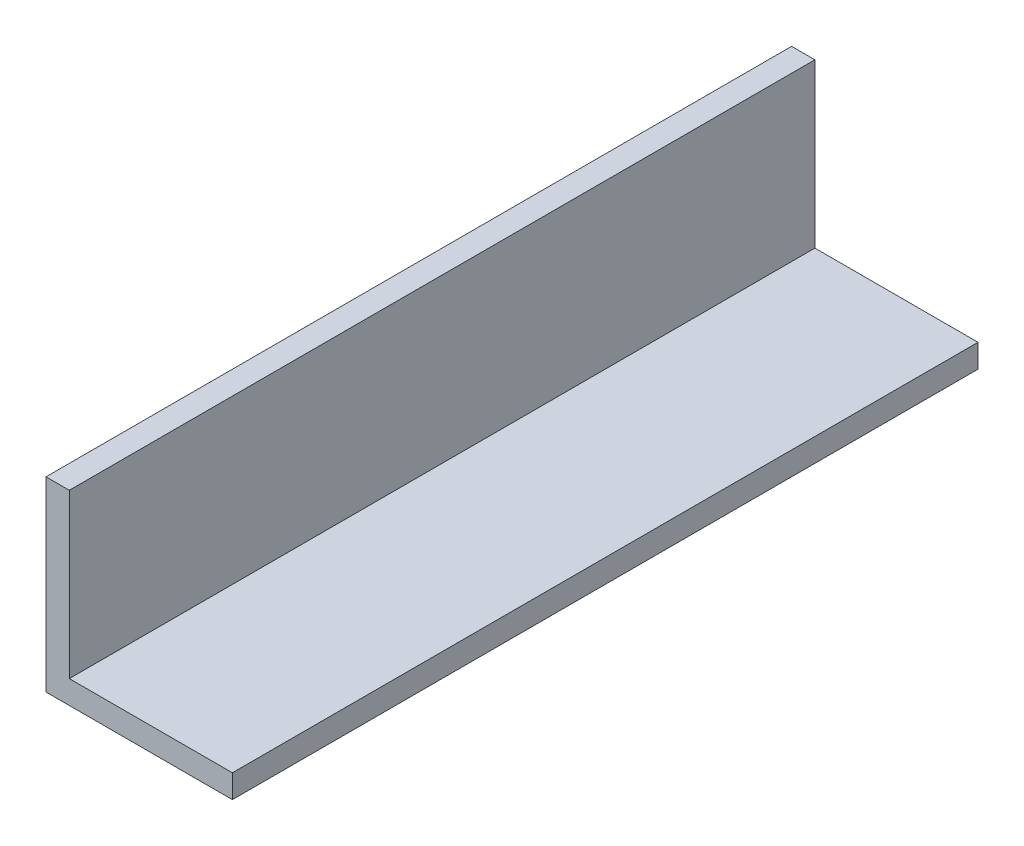
ISO-10303-21;
HEADER;
FILE_DESCRIPTION(('STEP AP214'),'2;1');
FILE_NAME('part.step','',(''),(''),'','','');
FILE_SCHEMA(('AUTOMOTIVE_DESIGN { 1 0 10303 214 1 1 1 1 }'));
ENDSEC;
DATA;
#1=APPLICATION_CONTEXT('core data for automotive mechanical design processes');
#2=APPLICATION_PROTOCOL_DEFINITION('international standard','automotive_design',2000,#1);
#3=PRODUCT_CONTEXT('',#1,'mechanical');
#4=PRODUCT('Part','Part','',(#3));
#5=PRODUCT_RELATED_PRODUCT_CATEGORY('part','',(#4));
#6=PRODUCT_DEFINITION_FORMATION('','',#4);
#7=PRODUCT_DEFINITION_CONTEXT('part definition',#1,'design');
#8=PRODUCT_DEFINITION('design','',#6,#7);
#9=PRODUCT_DEFINITION_SHAPE('','',#8);
#10=(LENGTH_UNIT() NAMED_UNIT(*) SI_UNIT(.MILLI.,.METRE.));
#11=(NAMED_UNIT(*) PLANE_ANGLE_UNIT() SI_UNIT($,.RADIAN.));
#12=(NAMED_UNIT(*) SI_UNIT($,.STERADIAN.) SOLID_ANGLE_UNIT());
#13=UNCERTAINTY_MEASURE_WITH_UNIT(LENGTH_MEASURE(1.E-05),#10,'distance_accuracy_value','');
#14=(GEOMETRIC_REPRESENTATION_CONTEXT(3) GLOBAL_UNCERTAINTY_ASSIGNED_CONTEXT((#13)) GLOBAL_UNIT_ASSIGNED_CONTEXT((#10,
#11,#12)) REPRESENTATION_CONTEXT('',''));
#15=CARTESIAN_POINT('',(0.,0.,0.));
#16=DIRECTION('',(0.,0.,1.));
#17=DIRECTION('',(1.,0.,0.));
#18=AXIS2_PLACEMENT_3D('',#15,#16,#17);
#19=CARTESIAN_POINT('',(-5.,4.79439197166468,160.));
#20=DIRECTION('',(0.,-1.,0.));
#21=DIRECTION('',(0.,0.,-1.));
#22=AXIS2_PLACEMENT_3D('',#19,#20,#21);
#23=PLANE('',#22);
#24=DIRECTION('',(-1.,0.,0.));
#25=VECTOR('',#24,1.);
#26=CARTESIAN_POINT('',(-5.,4.79439197166468,0.));
#27=LINE('',#26,#25);
#28=CARTESIAN_POINT('',(0.,4.79439197166468,0.));
#29=VERTEX_POINT('',#28);
#30=CARTESIAN_POINT('',(-5.,4.79439197166468,0.));
#31=VERTEX_POINT('',#30);
#32=EDGE_CURVE('E115',#29,#31,#27,.T.);
#33=ORIENTED_EDGE('',*,*,#32,.T.);
#34=DIRECTION('',(0.,0.,-1.));
#35=VECTOR('',#34,1.);
#36=CARTESIAN_POINT('',(-5.,4.79439197166468,160.));
#37=LINE('',#36,#35);
#38=CARTESIAN_POINT('',(-5.,4.79439197166468,160.));
#39=VERTEX_POINT('',#38);
#40=EDGE_CURVE('E11',#39,#31,#37,.T.);
#41=ORIENTED_EDGE('',*,*,#40,.F.);
#42=DIRECTION('',(-1.,0.,0.));
#43=VECTOR('',#42,1.);
#44=CARTESIAN_POINT('',(-5.,4.79439197166468,160.));
#45=LINE('',#44,#43);
#46=CARTESIAN_POINT('',(0.,4.79439197166468,160.));
#47=VERTEX_POINT('',#46);
#48=EDGE_CURVE('E125',#47,#39,#45,.T.);
#49=ORIENTED_EDGE('',*,*,#48,.F.);
#50=DIRECTION('',(0.,0.,-1.));
#51=VECTOR('',#50,1.);
#52=CARTESIAN_POINT('',(0.,4.79439197166468,160.));
#53=LINE('',#52,#51);
#54=EDGE_CURVE('E111',#47,#29,#53,.T.);
#55=ORIENTED_EDGE('',*,*,#54,.T.);
#56=EDGE_LOOP('',(#33,#41,#49,#55));
#57=FACE_BOUND('',#56,.T.);
#58=ADVANCED_FACE('F31',(#57),#23,.F.);
#59=CARTESIAN_POINT('',(-5.,-35.2056080283353,160.));
#60=DIRECTION('',(1.,0.,0.));
#61=DIRECTION('',(0.,0.,-1.));
#62=AXIS2_PLACEMENT_3D('',#59,#60,#61);
#63=PLANE('',#62);
#64=DIRECTION('',(0.,-1.,0.));
#65=VECTOR('',#64,1.);
#66=CARTESIAN_POINT('',(-5.,-35.2056080283353,0.));
#67=LINE('',#66,#65);
#68=CARTESIAN_POINT('',(-5.,-35.2056080283353,0.));
#69=VERTEX_POINT('',#68);
#70=EDGE_CURVE('E118',#31,#69,#67,.T.);
#71=ORIENTED_EDGE('',*,*,#70,.T.);
#72=DIRECTION('',(0.,0.,-1.));
#73=VECTOR('',#72,1.);
#74=CARTESIAN_POINT('',(-5.,-35.2056080283353,160.));
#75=LINE('',#74,#73);
#76=CARTESIAN_POINT('',(-5.,-35.2056080283353,160.));
#77=VERTEX_POINT('',#76);
#78=EDGE_CURVE('E39',#77,#69,#75,.T.);
#79=ORIENTED_EDGE('',*,*,#78,.F.);
#80=DIRECTION('',(0.,-1.,0.));
#81=VECTOR('',#80,1.);
#82=CARTESIAN_POINT('',(-5.,-35.2056080283353,160.));
#83=LINE('',#82,#81);
#84=EDGE_CURVE('E84',#39,#77,#83,.T.);
#85=ORIENTED_EDGE('',*,*,#84,.F.);
#86=ORIENTED_EDGE('',*,*,#40,.T.);
#87=EDGE_LOOP('',(#71,#79,#85,#86));
#88=FACE_BOUND('',#87,.T.);
#89=ADVANCED_FACE('F149',(#88),#63,.F.);
#90=CARTESIAN_POINT('',(35.,-35.2056080283353,160.));
#91=DIRECTION('',(0.,1.,0.));
#92=DIRECTION('',(0.,0.,1.));
#93=AXIS2_PLACEMENT_3D('',#90,#91,#92);
#94=PLANE('',#93);
#95=DIRECTION('',(1.,0.,0.));
#96=VECTOR('',#95,1.);
#97=CARTESIAN_POINT('',(35.,-35.2056080283353,0.));
#98=LINE('',#97,#96);
#99=CARTESIAN_POINT('',(35.,-35.2056080283353,0.));
#100=VERTEX_POINT('',#99);
#101=EDGE_CURVE('E120',#69,#100,#98,.T.);
#102=ORIENTED_EDGE('',*,*,#101,.T.);
#103=DIRECTION('',(0.,0.,-1.));
#104=VECTOR('',#103,1.);
#105=CARTESIAN_POINT('',(35.,-35.2056080283353,160.));
#106=LINE('',#105,#104);
#107=CARTESIAN_POINT('',(35.,-35.2056080283353,160.));
#108=VERTEX_POINT('',#107);
#109=EDGE_CURVE('E106',#108,#100,#106,.T.);
#110=ORIENTED_EDGE('',*,*,#109,.F.);
#111=DIRECTION('',(1.,0.,0.));
#112=VECTOR('',#111,1.);
#113=CARTESIAN_POINT('',(35.,-35.2056080283353,160.));
#114=LINE('',#113,#112);
#115=EDGE_CURVE('E97',#77,#108,#114,.T.);
#116=ORIENTED_EDGE('',*,*,#115,.F.);
#117=ORIENTED_EDGE('',*,*,#78,.T.);
#118=EDGE_LOOP('',(#102,#110,#116,#117));
#119=FACE_BOUND('',#118,.T.);
#120=ADVANCED_FACE('F131',(#119),#94,.F.);
#121=CARTESIAN_POINT('',(35.,-30.2056080283353,160.));
#122=DIRECTION('',(-1.,0.,0.));
#123=DIRECTION('',(0.,-1.,0.));
#124=AXIS2_PLACEMENT_3D('',#121,#122,#123);
#125=PLANE('',#124);
#126=DIRECTION('',(0.,1.,0.));
#127=VECTOR('',#126,1.);
#128=CARTESIAN_POINT('',(35.,-30.2056080283353,0.));
#129=LINE('',#128,#127);
#130=CARTESIAN_POINT('',(35.,-30.2056080283353,0.));
#131=VERTEX_POINT('',#130);
#132=EDGE_CURVE('E105',#100,#131,#129,.T.);
#133=ORIENTED_EDGE('',*,*,#132,.T.);
#134=DIRECTION('',(0.,0.,-1.));
#135=VECTOR('',#134,1.);
#136=CARTESIAN_POINT('',(35.,-30.2056080283353,160.));
#137=LINE('',#136,#135);
#138=CARTESIAN_POINT('',(35.,-30.2056080283353,160.));
#139=VERTEX_POINT('',#138);
#140=EDGE_CURVE('E102',#139,#131,#137,.T.);
#141=ORIENTED_EDGE('',*,*,#140,.F.);
#142=DIRECTION('',(0.,1.,0.));
#143=VECTOR('',#142,1.);
#144=CARTESIAN_POINT('',(35.,-30.2056080283353,160.));
#145=LINE('',#144,#143);
#146=EDGE_CURVE('E91',#108,#139,#145,.T.);
#147=ORIENTED_EDGE('',*,*,#146,.F.);
#148=ORIENTED_EDGE('',*,*,#109,.T.);
#149=EDGE_LOOP('',(#133,#141,#147,#148));
#150=FACE_BOUND('',#149,.T.);
#151=ADVANCED_FACE('F103',(#150),#125,.F.);
#152=CARTESIAN_POINT('',(0.,-30.2056080283353,160.));
#153=DIRECTION('',(0.,-1.,0.));
#154=DIRECTION('',(0.,0.,-1.));
#155=AXIS2_PLACEMENT_3D('',#152,#153,#154);
#156=PLANE('',#155);
#157=DIRECTION('',(-1.,0.,0.));
#158=VECTOR('',#157,1.);
#159=CARTESIAN_POINT('',(0.,-30.2056080283353,0.));
#160=LINE('',#159,#158);
#161=CARTESIAN_POINT('',(0.,-30.2056080283353,0.));
#162=VERTEX_POINT('',#161);
#163=EDGE_CURVE('E70',#131,#162,#160,.T.);
#164=ORIENTED_EDGE('',*,*,#163,.T.);
#165=DIRECTION('',(0.,0.,-1.));
#166=VECTOR('',#165,1.);
#167=CARTESIAN_POINT('',(0.,-30.2056080283353,160.));
#168=LINE('',#167,#166);
#169=CARTESIAN_POINT('',(0.,-30.2056080283353,160.));
#170=VERTEX_POINT('',#169);
#171=EDGE_CURVE('E107',#170,#162,#168,.T.);
#172=ORIENTED_EDGE('',*,*,#171,.F.);
#173=DIRECTION('',(-1.,0.,0.));
#174=VECTOR('',#173,1.);
#175=CARTESIAN_POINT('',(0.,-30.2056080283353,160.));
#176=LINE('',#175,#174);
#177=EDGE_CURVE('E95',#139,#170,#176,.T.);
#178=ORIENTED_EDGE('',*,*,#177,.F.);
#179=ORIENTED_EDGE('',*,*,#140,.T.);
#180=EDGE_LOOP('',(#164,#172,#178,#179));
#181=FACE_BOUND('',#180,.T.);
#182=ADVANCED_FACE('F109',(#181),#156,.F.);
#183=CARTESIAN_POINT('',(0.,4.79439197166468,160.));
#184=DIRECTION('',(-1.,0.,0.));
#185=DIRECTION('',(0.,-1.,0.));
#186=AXIS2_PLACEMENT_3D('',#183,#184,#185);
#187=PLANE('',#186);
#188=DIRECTION('',(0.,1.,0.));
#189=VECTOR('',#188,1.);
#190=CARTESIAN_POINT('',(0.,4.79439197166468,0.));
#191=LINE('',#190,#189);
#192=EDGE_CURVE('E76',#162,#29,#191,.T.);
#193=ORIENTED_EDGE('',*,*,#192,.T.);
#194=ORIENTED_EDGE('',*,*,#54,.F.);
#195=DIRECTION('',(0.,1.,0.));
#196=VECTOR('',#195,1.);
#197=CARTESIAN_POINT('',(0.,4.79439197166468,160.));
#198=LINE('',#197,#196);
#199=EDGE_CURVE('E47',#170,#47,#198,.T.);
#200=ORIENTED_EDGE('',*,*,#199,.F.);
#201=ORIENTED_EDGE('',*,*,#171,.T.);
#202=EDGE_LOOP('',(#193,#194,#200,#201));
#203=FACE_BOUND('',#202,.T.);
#204=ADVANCED_FACE('F138',(#203),#187,.F.);
#205=CARTESIAN_POINT('',(0.,4.79439197166468,160.));
#206=DIRECTION('',(0.,0.,-1.));
#207=DIRECTION('',(-1.,0.,0.));
#208=AXIS2_PLACEMENT_3D('',#205,#206,#207);
#209=PLANE('',#208);
#210=ORIENTED_EDGE('',*,*,#48,.T.);
#211=ORIENTED_EDGE('',*,*,#84,.T.);
#212=ORIENTED_EDGE('',*,*,#115,.T.);
#213=ORIENTED_EDGE('',*,*,#146,.T.);
#214=ORIENTED_EDGE('',*,*,#177,.T.);
#215=ORIENTED_EDGE('',*,*,#199,.T.);
#216=EDGE_LOOP('',(#210,#211,#212,#213,#214,#215));
#217=FACE_BOUND('',#216,.T.);
#218=ADVANCED_FACE('F93',(#217),#209,.F.);
#219=CARTESIAN_POINT('',(0.,4.79439197166468,0.));
#220=DIRECTION('',(0.,0.,-1.));
#221=DIRECTION('',(-1.,0.,0.));
#222=AXIS2_PLACEMENT_3D('',#219,#220,#221);
#223=PLANE('',#222);
#224=ORIENTED_EDGE('',*,*,#32,.F.);
#225=ORIENTED_EDGE('',*,*,#192,.F.);
#226=ORIENTED_EDGE('',*,*,#163,.F.);
#227=ORIENTED_EDGE('',*,*,#132,.F.);
#228=ORIENTED_EDGE('',*,*,#101,.F.);
#229=ORIENTED_EDGE('',*,*,#70,.F.);
#230=EDGE_LOOP('',(#224,#225,#226,#227,#228,#229));
#231=FACE_BOUND('',#230,.T.);
#232=ADVANCED_FACE('F134',(#231),#223,.T.);
#233=CLOSED_SHELL('',(#58,#89,#120,#151,#182,#204,#218,#232));
#234=MANIFOLD_SOLID_BREP('B2',#233);
#235=ADVANCED_BREP_SHAPE_REPRESENTATION('',(#18,#234),#14);
#236=SHAPE_DEFINITION_REPRESENTATION(#9,#235);
ENDSEC;
END-ISO-10303-21;
